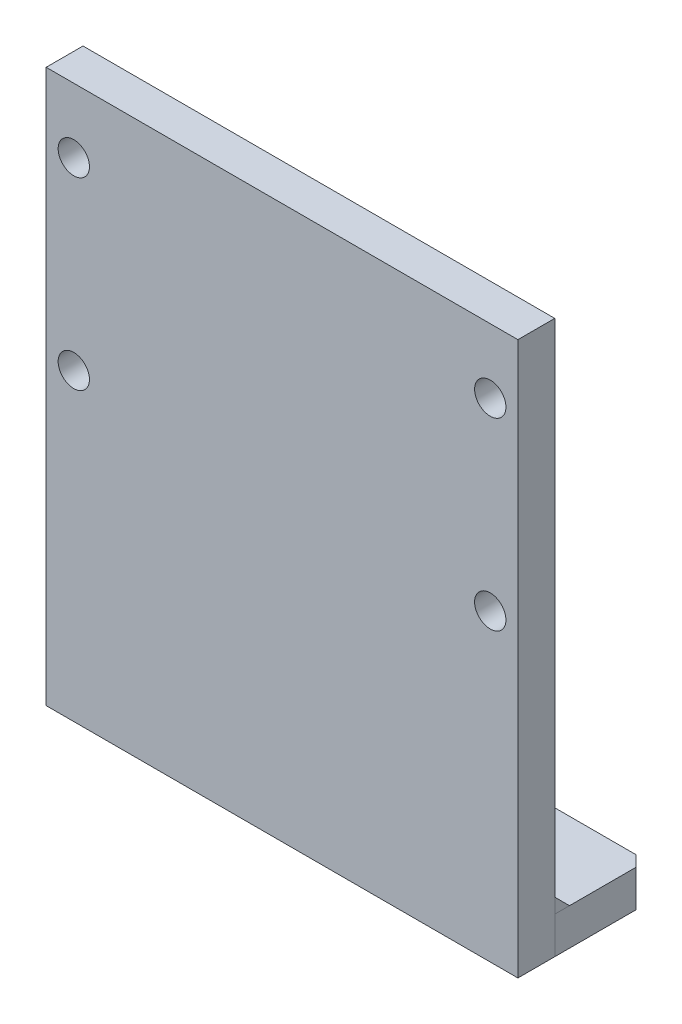
ISO-10303-21;
HEADER;
FILE_DESCRIPTION(('STEP AP214'),'2;1');
FILE_NAME('part.step','',(''),(''),'','','');
FILE_SCHEMA(('AUTOMOTIVE_DESIGN { 1 0 10303 214 1 1 1 1 }'));
ENDSEC;
DATA;
#1=APPLICATION_CONTEXT('core data for automotive mechanical design processes');
#2=APPLICATION_PROTOCOL_DEFINITION('international standard','automotive_design',2000,#1);
#3=PRODUCT_CONTEXT('',#1,'mechanical');
#4=PRODUCT('Part','Part','',(#3));
#5=PRODUCT_RELATED_PRODUCT_CATEGORY('part','',(#4));
#6=PRODUCT_DEFINITION_FORMATION('','',#4);
#7=PRODUCT_DEFINITION_CONTEXT('part definition',#1,'design');
#8=PRODUCT_DEFINITION('design','',#6,#7);
#9=PRODUCT_DEFINITION_SHAPE('','',#8);
#10=(LENGTH_UNIT() NAMED_UNIT(*) SI_UNIT(.MILLI.,.METRE.));
#11=(NAMED_UNIT(*) PLANE_ANGLE_UNIT() SI_UNIT($,.RADIAN.));
#12=(NAMED_UNIT(*) SI_UNIT($,.STERADIAN.) SOLID_ANGLE_UNIT());
#13=UNCERTAINTY_MEASURE_WITH_UNIT(LENGTH_MEASURE(1.E-05),#10,'distance_accuracy_value','');
#14=(GEOMETRIC_REPRESENTATION_CONTEXT(3) GLOBAL_UNCERTAINTY_ASSIGNED_CONTEXT((#13)) GLOBAL_UNIT_ASSIGNED_CONTEXT((#10,
#11,#12)) REPRESENTATION_CONTEXT('',''));
#15=CARTESIAN_POINT('',(0.,0.,0.));
#16=DIRECTION('',(0.,0.,1.));
#17=DIRECTION('',(1.,0.,0.));
#18=AXIS2_PLACEMENT_3D('',#15,#16,#17);
#19=CARTESIAN_POINT('',(-64.,-65.,-5.));
#20=DIRECTION('',(-1.,0.,0.));
#21=DIRECTION('',(0.,-1.,0.));
#22=AXIS2_PLACEMENT_3D('',#19,#20,#21);
#23=PLANE('',#22);
#24=DIRECTION('',(0.,-0.707106781186549,-0.707106781186546));
#25=VECTOR('',#24,1.);
#26=CARTESIAN_POINT('',(-64.,-65.,-8.99999999999999));
#27=LINE('',#26,#25);
#28=CARTESIAN_POINT('',(-64.,-61.,-5.));
#29=VERTEX_POINT('',#28);
#30=CARTESIAN_POINT('',(-64.,-65.,-8.99999999999999));
#31=VERTEX_POINT('',#30);
#32=EDGE_CURVE('E12',#29,#31,#27,.T.);
#33=ORIENTED_EDGE('',*,*,#32,.T.);
#34=DIRECTION('',(0.,0.,-1.));
#35=VECTOR('',#34,1.);
#36=CARTESIAN_POINT('',(-64.,-65.,-30.));
#37=LINE('',#36,#35);
#38=CARTESIAN_POINT('',(-64.,-65.,-5.));
#39=VERTEX_POINT('',#38);
#40=EDGE_CURVE('E85',#31,#39,#37,.F.);
#41=ORIENTED_EDGE('',*,*,#40,.T.);
#42=DIRECTION('',(0.,-1.,0.));
#43=VECTOR('',#42,1.);
#44=CARTESIAN_POINT('',(-64.,-65.,-5.));
#45=LINE('',#44,#43);
#46=EDGE_CURVE('E87',#29,#39,#45,.T.);
#47=ORIENTED_EDGE('',*,*,#46,.F.);
#48=EDGE_LOOP('',(#33,#41,#47));
#49=FACE_BOUND('',#48,.T.);
#50=ADVANCED_FACE('F47',(#49),#23,.T.);
#51=CARTESIAN_POINT('',(64.,-65.,-5.));
#52=DIRECTION('',(1.,0.,0.));
#53=DIRECTION('',(0.,1.,0.));
#54=AXIS2_PLACEMENT_3D('',#51,#52,#53);
#55=PLANE('',#54);
#56=DIRECTION('',(0.,0.,-1.));
#57=VECTOR('',#56,1.);
#58=CARTESIAN_POINT('',(64.,-65.,-5.));
#59=LINE('',#58,#57);
#60=CARTESIAN_POINT('',(64.,-65.,-8.99999999999999));
#61=VERTEX_POINT('',#60);
#62=CARTESIAN_POINT('',(64.,-65.,-5.));
#63=VERTEX_POINT('',#62);
#64=EDGE_CURVE('E68',#61,#63,#59,.F.);
#65=ORIENTED_EDGE('',*,*,#64,.F.);
#66=DIRECTION('',(0.,0.707106781186549,0.707106781186546));
#67=VECTOR('',#66,1.);
#68=CARTESIAN_POINT('',(64.,-65.,-8.99999999999998));
#69=LINE('',#68,#67);
#70=CARTESIAN_POINT('',(64.,-61.,-5.));
#71=VERTEX_POINT('',#70);
#72=EDGE_CURVE('E55',#61,#71,#69,.T.);
#73=ORIENTED_EDGE('',*,*,#72,.T.);
#74=DIRECTION('',(0.,-1.,0.));
#75=VECTOR('',#74,1.);
#76=CARTESIAN_POINT('',(64.,75.,-5.));
#77=LINE('',#76,#75);
#78=EDGE_CURVE('E62',#71,#63,#77,.T.);
#79=ORIENTED_EDGE('',*,*,#78,.T.);
#80=EDGE_LOOP('',(#65,#73,#79));
#81=FACE_BOUND('',#80,.T.);
#82=ADVANCED_FACE('F102',(#81),#55,.T.);
#83=CARTESIAN_POINT('',(-64.,-65.,-8.99999999999999));
#84=DIRECTION('',(0.,-0.707106781186546,0.707106781186549));
#85=DIRECTION('',(0.,-0.707106781186549,-0.707106781186546));
#86=AXIS2_PLACEMENT_3D('',#83,#84,#85);
#87=PLANE('',#86);
#88=ORIENTED_EDGE('',*,*,#32,.F.);
#89=DIRECTION('',(-1.,0.,0.));
#90=VECTOR('',#89,1.);
#91=CARTESIAN_POINT('',(64.,-61.,-5.));
#92=LINE('',#91,#90);
#93=EDGE_CURVE('E90',#71,#29,#92,.T.);
#94=ORIENTED_EDGE('',*,*,#93,.F.);
#95=ORIENTED_EDGE('',*,*,#72,.F.);
#96=DIRECTION('',(1.,0.,0.));
#97=VECTOR('',#96,1.);
#98=CARTESIAN_POINT('',(-64.,-65.,-8.99999999999999));
#99=LINE('',#98,#97);
#100=EDGE_CURVE('E98',#31,#61,#99,.T.);
#101=ORIENTED_EDGE('',*,*,#100,.F.);
#102=EDGE_LOOP('',(#88,#94,#95,#101));
#103=FACE_BOUND('',#102,.T.);
#104=ADVANCED_FACE('F49',(#103),#87,.F.);
#105=CARTESIAN_POINT('',(-64.,-65.,-30.));
#106=DIRECTION('',(0.,-1.,0.));
#107=DIRECTION('',(0.,0.,-1.));
#108=AXIS2_PLACEMENT_3D('',#105,#106,#107);
#109=PLANE('',#108);
#110=ORIENTED_EDGE('',*,*,#100,.T.);
#111=ORIENTED_EDGE('',*,*,#64,.T.);
#112=DIRECTION('',(1.,0.,0.));
#113=VECTOR('',#112,1.);
#114=CARTESIAN_POINT('',(-64.,-65.,-5.));
#115=LINE('',#114,#113);
#116=EDGE_CURVE('E81',#39,#63,#115,.T.);
#117=ORIENTED_EDGE('',*,*,#116,.F.);
#118=ORIENTED_EDGE('',*,*,#40,.F.);
#119=EDGE_LOOP('',(#110,#111,#117,#118));
#120=FACE_BOUND('',#119,.T.);
#121=ADVANCED_FACE('F83',(#120),#109,.T.);
#122=CARTESIAN_POINT('',(64.,75.,-5.));
#123=DIRECTION('',(0.,0.,-1.));
#124=DIRECTION('',(-1.,0.,0.));
#125=AXIS2_PLACEMENT_3D('',#122,#123,#124);
#126=PLANE('',#125);
#127=ORIENTED_EDGE('',*,*,#93,.T.);
#128=ORIENTED_EDGE('',*,*,#46,.T.);
#129=ORIENTED_EDGE('',*,*,#116,.T.);
#130=ORIENTED_EDGE('',*,*,#78,.F.);
#131=EDGE_LOOP('',(#127,#128,#129,#130));
#132=FACE_BOUND('',#131,.T.);
#133=ADVANCED_FACE('F88',(#132),#126,.F.);
#134=CLOSED_SHELL('',(#50,#82,#104,#121,#133));
#135=MANIFOLD_SOLID_BREP('B2',#134);
#136=CARTESIAN_POINT('',(-64.,-65.,-5.));
#137=DIRECTION('',(-1.,0.,0.));
#138=DIRECTION('',(0.,-1.,0.));
#139=AXIS2_PLACEMENT_3D('',#136,#137,#138);
#140=PLANE('',#139);
#141=DIRECTION('',(0.,0.,-1.));
#142=VECTOR('',#141,1.);
#143=CARTESIAN_POINT('',(-64.,-65.,-5.));
#144=LINE('',#143,#142);
#145=CARTESIAN_POINT('',(-64.,-65.,-5.));
#146=VERTEX_POINT('',#145);
#147=CARTESIAN_POINT('',(-64.,-65.,-27.));
#148=VERTEX_POINT('',#147);
#149=EDGE_CURVE('E229',#146,#148,#144,.T.);
#150=ORIENTED_EDGE('',*,*,#149,.T.);
#151=DIRECTION('',(0.,-1.,0.));
#152=VECTOR('',#151,1.);
#153=CARTESIAN_POINT('',(-64.,-65.,-27.));
#154=LINE('',#153,#152);
#155=CARTESIAN_POINT('',(-64.,-75.,-27.));
#156=VERTEX_POINT('',#155);
#157=EDGE_CURVE('E243',#148,#156,#154,.T.);
#158=ORIENTED_EDGE('',*,*,#157,.T.);
#159=DIRECTION('',(0.,0.,-1.));
#160=VECTOR('',#159,1.);
#161=CARTESIAN_POINT('',(-64.,-75.,-5.));
#162=LINE('',#161,#160);
#163=CARTESIAN_POINT('',(-64.,-75.,-5.));
#164=VERTEX_POINT('',#163);
#165=EDGE_CURVE('E233',#164,#156,#162,.T.);
#166=ORIENTED_EDGE('',*,*,#165,.F.);
#167=DIRECTION('',(0.,-1.,0.));
#168=VECTOR('',#167,1.);
#169=CARTESIAN_POINT('',(-64.,-65.,-5.));
#170=LINE('',#169,#168);
#171=EDGE_CURVE('E224',#146,#164,#170,.T.);
#172=ORIENTED_EDGE('',*,*,#171,.F.);
#173=EDGE_LOOP('',(#150,#158,#166,#172));
#174=FACE_BOUND('',#173,.T.);
#175=ADVANCED_FACE('F159',(#174),#140,.T.);
#176=CARTESIAN_POINT('',(-64.,-65.,-5.));
#177=DIRECTION('',(0.,0.,1.));
#178=DIRECTION('',(1.,0.,0.));
#179=AXIS2_PLACEMENT_3D('',#176,#177,#178);
#180=PLANE('',#179);
#181=DIRECTION('',(-1.,0.,0.));
#182=VECTOR('',#181,1.);
#183=CARTESIAN_POINT('',(-64.,-75.,-5.));
#184=LINE('',#183,#182);
#185=CARTESIAN_POINT('',(64.,-75.,-5.));
#186=VERTEX_POINT('',#185);
#187=EDGE_CURVE('E223',#186,#164,#184,.T.);
#188=ORIENTED_EDGE('',*,*,#187,.F.);
#189=DIRECTION('',(0.,-1.,0.));
#190=VECTOR('',#189,1.);
#191=CARTESIAN_POINT('',(64.,-65.,-5.));
#192=LINE('',#191,#190);
#193=CARTESIAN_POINT('',(64.,-65.,-5.));
#194=VERTEX_POINT('',#193);
#195=EDGE_CURVE('E213',#194,#186,#192,.T.);
#196=ORIENTED_EDGE('',*,*,#195,.F.);
#197=DIRECTION('',(-1.,0.,0.));
#198=VECTOR('',#197,1.);
#199=CARTESIAN_POINT('',(-64.,-65.,-5.));
#200=LINE('',#199,#198);
#201=EDGE_CURVE('E216',#194,#146,#200,.T.);
#202=ORIENTED_EDGE('',*,*,#201,.T.);
#203=ORIENTED_EDGE('',*,*,#171,.T.);
#204=EDGE_LOOP('',(#188,#196,#202,#203));
#205=FACE_BOUND('',#204,.T.);
#206=ADVANCED_FACE('F221',(#205),#180,.T.);
#207=CARTESIAN_POINT('',(64.,-65.,-5.));
#208=DIRECTION('',(1.,0.,0.));
#209=DIRECTION('',(0.,1.,0.));
#210=AXIS2_PLACEMENT_3D('',#207,#208,#209);
#211=PLANE('',#210);
#212=DIRECTION('',(0.,0.,1.));
#213=VECTOR('',#212,1.);
#214=CARTESIAN_POINT('',(64.,-75.,-5.));
#215=LINE('',#214,#213);
#216=CARTESIAN_POINT('',(64.,-75.,-27.));
#217=VERTEX_POINT('',#216);
#218=EDGE_CURVE('E240',#217,#186,#215,.T.);
#219=ORIENTED_EDGE('',*,*,#218,.F.);
#220=DIRECTION('',(0.,1.,0.));
#221=VECTOR('',#220,1.);
#222=CARTESIAN_POINT('',(64.,-65.,-27.));
#223=LINE('',#222,#221);
#224=CARTESIAN_POINT('',(64.,-65.,-27.));
#225=VERTEX_POINT('',#224);
#226=EDGE_CURVE('E45',#217,#225,#223,.T.);
#227=ORIENTED_EDGE('',*,*,#226,.T.);
#228=DIRECTION('',(0.,0.,1.));
#229=VECTOR('',#228,1.);
#230=CARTESIAN_POINT('',(64.,-65.,-5.));
#231=LINE('',#230,#229);
#232=EDGE_CURVE('E210',#225,#194,#231,.T.);
#233=ORIENTED_EDGE('',*,*,#232,.T.);
#234=ORIENTED_EDGE('',*,*,#195,.T.);
#235=EDGE_LOOP('',(#219,#227,#233,#234));
#236=FACE_BOUND('',#235,.T.);
#237=ADVANCED_FACE('F212',(#236),#211,.T.);
#238=CARTESIAN_POINT('',(-64.,-65.,-30.));
#239=DIRECTION('',(0.,0.,-1.));
#240=DIRECTION('',(-1.,0.,0.));
#241=AXIS2_PLACEMENT_3D('',#238,#239,#240);
#242=PLANE('',#241);
#243=DIRECTION('',(1.,0.,0.));
#244=VECTOR('',#243,1.);
#245=CARTESIAN_POINT('',(-64.,-75.,-30.));
#246=LINE('',#245,#244);
#247=CARTESIAN_POINT('',(-61.,-75.,-30.));
#248=VERTEX_POINT('',#247);
#249=CARTESIAN_POINT('',(61.,-75.,-30.));
#250=VERTEX_POINT('',#249);
#251=EDGE_CURVE('E236',#248,#250,#246,.T.);
#252=ORIENTED_EDGE('',*,*,#251,.F.);
#253=DIRECTION('',(0.,1.,0.));
#254=VECTOR('',#253,1.);
#255=CARTESIAN_POINT('',(-61.,-65.,-30.));
#256=LINE('',#255,#254);
#257=CARTESIAN_POINT('',(-61.,-65.,-30.));
#258=VERTEX_POINT('',#257);
#259=EDGE_CURVE('E254',#248,#258,#256,.T.);
#260=ORIENTED_EDGE('',*,*,#259,.T.);
#261=DIRECTION('',(1.,0.,0.));
#262=VECTOR('',#261,1.);
#263=CARTESIAN_POINT('',(-64.,-65.,-30.));
#264=LINE('',#263,#262);
#265=CARTESIAN_POINT('',(61.,-65.,-30.));
#266=VERTEX_POINT('',#265);
#267=EDGE_CURVE('E217',#258,#266,#264,.T.);
#268=ORIENTED_EDGE('',*,*,#267,.T.);
#269=DIRECTION('',(0.,-1.,0.));
#270=VECTOR('',#269,1.);
#271=CARTESIAN_POINT('',(61.,-65.,-30.));
#272=LINE('',#271,#270);
#273=EDGE_CURVE('E251',#266,#250,#272,.T.);
#274=ORIENTED_EDGE('',*,*,#273,.T.);
#275=EDGE_LOOP('',(#252,#260,#268,#274));
#276=FACE_BOUND('',#275,.T.);
#277=ADVANCED_FACE('F268',(#276),#242,.T.);
#278=CARTESIAN_POINT('',(-64.,-65.,-30.));
#279=DIRECTION('',(0.,-1.,0.));
#280=DIRECTION('',(0.,0.,-1.));
#281=AXIS2_PLACEMENT_3D('',#278,#279,#280);
#282=PLANE('',#281);
#283=CARTESIAN_POINT('',(40.,-65.,-20.));
#284=DIRECTION('',(0.,-1.,0.));
#285=DIRECTION('',(-1.,0.,0.));
#286=AXIS2_PLACEMENT_3D('',#283,#284,#285);
#287=CIRCLE('',#286,4.25);
#288=CARTESIAN_POINT('',(35.75,-65.,-20.));
#289=VERTEX_POINT('',#288);
#290=EDGE_CURVE('E304',#289,#289,#287,.T.);
#291=ORIENTED_EDGE('',*,*,#290,.T.);
#292=EDGE_LOOP('',(#291));
#293=FACE_BOUND('',#292,.T.);
#294=CARTESIAN_POINT('',(-40.,-65.,-20.));
#295=DIRECTION('',(0.,-1.,0.));
#296=DIRECTION('',(1.,0.,0.));
#297=AXIS2_PLACEMENT_3D('',#294,#295,#296);
#298=CIRCLE('',#297,4.25);
#299=CARTESIAN_POINT('',(-35.75,-65.,-20.));
#300=VERTEX_POINT('',#299);
#301=EDGE_CURVE('E237',#300,#300,#298,.T.);
#302=ORIENTED_EDGE('',*,*,#301,.T.);
#303=EDGE_LOOP('',(#302));
#304=FACE_BOUND('',#303,.T.);
#305=ORIENTED_EDGE('',*,*,#267,.F.);
#306=DIRECTION('',(0.707106781186549,0.,-0.707106781186546));
#307=VECTOR('',#306,1.);
#308=CARTESIAN_POINT('',(-64.,-65.,-27.));
#309=LINE('',#308,#307);
#310=EDGE_CURVE('E167',#258,#148,#309,.F.);
#311=ORIENTED_EDGE('',*,*,#310,.T.);
#312=ORIENTED_EDGE('',*,*,#149,.F.);
#313=ORIENTED_EDGE('',*,*,#201,.F.);
#314=ORIENTED_EDGE('',*,*,#232,.F.);
#315=DIRECTION('',(0.707106781186544,0.,0.707106781186551));
#316=VECTOR('',#315,1.);
#317=CARTESIAN_POINT('',(61.,-65.,-30.));
#318=LINE('',#317,#316);
#319=EDGE_CURVE('E179',#225,#266,#318,.F.);
#320=ORIENTED_EDGE('',*,*,#319,.T.);
#321=EDGE_LOOP('',(#305,#311,#312,#313,#314,#320));
#322=FACE_BOUND('',#321,.T.);
#323=ADVANCED_FACE('F227',(#293,#304,#322),#282,.F.);
#324=CARTESIAN_POINT('',(-64.,-75.,-30.));
#325=DIRECTION('',(0.,-1.,0.));
#326=DIRECTION('',(0.,0.,-1.));
#327=AXIS2_PLACEMENT_3D('',#324,#325,#326);
#328=PLANE('',#327);
#329=CARTESIAN_POINT('',(40.,-75.,-20.));
#330=DIRECTION('',(0.,-1.,0.));
#331=DIRECTION('',(-1.,0.,0.));
#332=AXIS2_PLACEMENT_3D('',#329,#330,#331);
#333=CIRCLE('',#332,4.25);
#334=CARTESIAN_POINT('',(35.75,-75.,-20.));
#335=VERTEX_POINT('',#334);
#336=EDGE_CURVE('E307',#335,#335,#333,.T.);
#337=ORIENTED_EDGE('',*,*,#336,.F.);
#338=EDGE_LOOP('',(#337));
#339=FACE_BOUND('',#338,.T.);
#340=CARTESIAN_POINT('',(-40.,-75.,-20.));
#341=DIRECTION('',(0.,-1.,0.));
#342=DIRECTION('',(1.,0.,0.));
#343=AXIS2_PLACEMENT_3D('',#340,#341,#342);
#344=CIRCLE('',#343,4.25);
#345=CARTESIAN_POINT('',(-35.75,-75.,-20.));
#346=VERTEX_POINT('',#345);
#347=EDGE_CURVE('E309',#346,#346,#344,.T.);
#348=ORIENTED_EDGE('',*,*,#347,.F.);
#349=EDGE_LOOP('',(#348));
#350=FACE_BOUND('',#349,.T.);
#351=ORIENTED_EDGE('',*,*,#165,.T.);
#352=DIRECTION('',(-0.707106781186549,0.,0.707106781186546));
#353=VECTOR('',#352,1.);
#354=CARTESIAN_POINT('',(-62.5,-75.,-28.5));
#355=LINE('',#354,#353);
#356=EDGE_CURVE('E249',#156,#248,#355,.F.);
#357=ORIENTED_EDGE('',*,*,#356,.T.);
#358=ORIENTED_EDGE('',*,*,#251,.T.);
#359=DIRECTION('',(-0.707106781186544,0.,-0.707106781186551));
#360=VECTOR('',#359,1.);
#361=CARTESIAN_POINT('',(-1.49999999999942,-75.,-92.5));
#362=LINE('',#361,#360);
#363=EDGE_CURVE('E247',#250,#217,#362,.F.);
#364=ORIENTED_EDGE('',*,*,#363,.T.);
#365=ORIENTED_EDGE('',*,*,#218,.T.);
#366=ORIENTED_EDGE('',*,*,#187,.T.);
#367=EDGE_LOOP('',(#351,#357,#358,#364,#365,#366));
#368=FACE_BOUND('',#367,.T.);
#369=ADVANCED_FACE('F266',(#339,#350,#368),#328,.T.);
#370=CARTESIAN_POINT('',(-40.,-65.,-20.));
#371=DIRECTION('',(0.,-1.,0.));
#372=DIRECTION('',(1.,0.,0.));
#373=AXIS2_PLACEMENT_3D('',#370,#371,#372);
#374=CYLINDRICAL_SURFACE('',#373,4.25);
#375=ORIENTED_EDGE('',*,*,#301,.F.);
#376=EDGE_LOOP('',(#375));
#377=FACE_BOUND('',#376,.T.);
#378=ORIENTED_EDGE('',*,*,#347,.T.);
#379=EDGE_LOOP('',(#378));
#380=FACE_BOUND('',#379,.T.);
#381=ADVANCED_FACE('F289',(#377,#380),#374,.F.);
#382=CARTESIAN_POINT('',(40.,-65.,-20.));
#383=DIRECTION('',(0.,-1.,0.));
#384=DIRECTION('',(1.,0.,0.));
#385=AXIS2_PLACEMENT_3D('',#382,#383,#384);
#386=CYLINDRICAL_SURFACE('',#385,4.25);
#387=ORIENTED_EDGE('',*,*,#290,.F.);
#388=EDGE_LOOP('',(#387));
#389=FACE_BOUND('',#388,.T.);
#390=ORIENTED_EDGE('',*,*,#336,.T.);
#391=EDGE_LOOP('',(#390));
#392=FACE_BOUND('',#391,.T.);
#393=ADVANCED_FACE('F275',(#389,#392),#386,.F.);
#394=CARTESIAN_POINT('',(-64.,-65.,-27.));
#395=DIRECTION('',(0.707106781186546,0.,0.707106781186549));
#396=DIRECTION('',(0.707106781186549,0.,-0.707106781186546));
#397=AXIS2_PLACEMENT_3D('',#394,#395,#396);
#398=PLANE('',#397);
#399=ORIENTED_EDGE('',*,*,#310,.F.);
#400=ORIENTED_EDGE('',*,*,#259,.F.);
#401=ORIENTED_EDGE('',*,*,#356,.F.);
#402=ORIENTED_EDGE('',*,*,#157,.F.);
#403=EDGE_LOOP('',(#399,#400,#401,#402));
#404=FACE_BOUND('',#403,.T.);
#405=ADVANCED_FACE('F263',(#404),#398,.F.);
#406=CARTESIAN_POINT('',(61.,-65.,-30.));
#407=DIRECTION('',(-0.707106781186551,0.,0.707106781186544));
#408=DIRECTION('',(0.707106781186544,0.,0.707106781186551));
#409=AXIS2_PLACEMENT_3D('',#406,#407,#408);
#410=PLANE('',#409);
#411=ORIENTED_EDGE('',*,*,#319,.F.);
#412=ORIENTED_EDGE('',*,*,#226,.F.);
#413=ORIENTED_EDGE('',*,*,#363,.F.);
#414=ORIENTED_EDGE('',*,*,#273,.F.);
#415=EDGE_LOOP('',(#411,#412,#413,#414));
#416=FACE_BOUND('',#415,.T.);
#417=ADVANCED_FACE('F161',(#416),#410,.F.);
#418=CLOSED_SHELL('',(#175,#206,#237,#277,#323,#369,#381,#393,#405,#417));
#419=MANIFOLD_SOLID_BREP('B6',#418);
#420=CARTESIAN_POINT('',(64.,75.,5.));
#421=DIRECTION('',(0.,0.,-1.));
#422=DIRECTION('',(-1.,0.,0.));
#423=AXIS2_PLACEMENT_3D('',#420,#421,#422);
#424=PLANE('',#423);
#425=CARTESIAN_POINT('',(56.5000000000001,7.50000000000002,5.));
#426=DIRECTION('',(0.,0.,1.));
#427=DIRECTION('',(-1.,0.,0.));
#428=AXIS2_PLACEMENT_3D('',#425,#426,#427);
#429=CIRCLE('',#428,4.25);
#430=CARTESIAN_POINT('',(52.2500000000001,7.50000000000002,5.));
#431=VERTEX_POINT('',#430);
#432=EDGE_CURVE('E464',#431,#431,#429,.T.);
#433=ORIENTED_EDGE('',*,*,#432,.F.);
#434=EDGE_LOOP('',(#433));
#435=FACE_BOUND('',#434,.T.);
#436=CARTESIAN_POINT('',(-56.5000000000001,57.5,5.));
#437=DIRECTION('',(0.,0.,1.));
#438=DIRECTION('',(1.,0.,0.));
#439=AXIS2_PLACEMENT_3D('',#436,#437,#438);
#440=CIRCLE('',#439,4.25);
#441=CARTESIAN_POINT('',(-52.2500000000001,57.5,5.));
#442=VERTEX_POINT('',#441);
#443=EDGE_CURVE('E443',#442,#442,#440,.T.);
#444=ORIENTED_EDGE('',*,*,#443,.F.);
#445=EDGE_LOOP('',(#444));
#446=FACE_BOUND('',#445,.T.);
#447=DIRECTION('',(0.,1.,0.));
#448=VECTOR('',#447,1.);
#449=CARTESIAN_POINT('',(64.,-75.,5.));
#450=LINE('',#449,#448);
#451=CARTESIAN_POINT('',(64.,-75.,5.));
#452=VERTEX_POINT('',#451);
#453=CARTESIAN_POINT('',(64.,75.,5.));
#454=VERTEX_POINT('',#453);
#455=EDGE_CURVE('E428',#452,#454,#450,.T.);
#456=ORIENTED_EDGE('',*,*,#455,.T.);
#457=DIRECTION('',(-1.,0.,0.));
#458=VECTOR('',#457,1.);
#459=CARTESIAN_POINT('',(-64.,75.,5.));
#460=LINE('',#459,#458);
#461=CARTESIAN_POINT('',(-64.,75.,5.));
#462=VERTEX_POINT('',#461);
#463=EDGE_CURVE('E423',#454,#462,#460,.T.);
#464=ORIENTED_EDGE('',*,*,#463,.T.);
#465=DIRECTION('',(0.,-1.,0.));
#466=VECTOR('',#465,1.);
#467=CARTESIAN_POINT('',(-64.,-75.,5.));
#468=LINE('',#467,#466);
#469=CARTESIAN_POINT('',(-64.,-75.,5.));
#470=VERTEX_POINT('',#469);
#471=EDGE_CURVE('E426',#462,#470,#468,.T.);
#472=ORIENTED_EDGE('',*,*,#471,.T.);
#473=DIRECTION('',(1.,0.,0.));
#474=VECTOR('',#473,1.);
#475=CARTESIAN_POINT('',(-64.,-75.,5.));
#476=LINE('',#475,#474);
#477=EDGE_CURVE('E393',#470,#452,#476,.T.);
#478=ORIENTED_EDGE('',*,*,#477,.T.);
#479=EDGE_LOOP('',(#456,#464,#472,#478));
#480=FACE_BOUND('',#479,.T.);
#481=CARTESIAN_POINT('',(-56.5000000000001,7.50000000000001,5.));
#482=DIRECTION('',(0.,0.,1.));
#483=DIRECTION('',(1.,0.,0.));
#484=AXIS2_PLACEMENT_3D('',#481,#482,#483);
#485=CIRCLE('',#484,4.25);
#486=CARTESIAN_POINT('',(-52.2500000000001,7.50000000000001,5.));
#487=VERTEX_POINT('',#486);
#488=EDGE_CURVE('E458',#487,#487,#485,.T.);
#489=ORIENTED_EDGE('',*,*,#488,.F.);
#490=EDGE_LOOP('',(#489));
#491=FACE_BOUND('',#490,.T.);
#492=CARTESIAN_POINT('',(56.5000000000001,57.5,5.));
#493=DIRECTION('',(0.,0.,1.));
#494=DIRECTION('',(-1.,0.,0.));
#495=AXIS2_PLACEMENT_3D('',#492,#493,#494);
#496=CIRCLE('',#495,4.25);
#497=CARTESIAN_POINT('',(52.2500000000001,57.5,5.));
#498=VERTEX_POINT('',#497);
#499=EDGE_CURVE('E470',#498,#498,#496,.T.);
#500=ORIENTED_EDGE('',*,*,#499,.F.);
#501=EDGE_LOOP('',(#500));
#502=FACE_BOUND('',#501,.T.);
#503=ADVANCED_FACE('F376',(#435,#446,#480,#491,#502),#424,.F.);
#504=CARTESIAN_POINT('',(64.,75.,-5.));
#505=DIRECTION('',(0.,0.,-1.));
#506=DIRECTION('',(-1.,0.,0.));
#507=AXIS2_PLACEMENT_3D('',#504,#505,#506);
#508=PLANE('',#507);
#509=CARTESIAN_POINT('',(56.5000000000001,7.50000000000002,-5.));
#510=DIRECTION('',(0.,0.,1.));
#511=DIRECTION('',(-1.,0.,0.));
#512=AXIS2_PLACEMENT_3D('',#509,#510,#511);
#513=CIRCLE('',#512,4.25);
#514=CARTESIAN_POINT('',(52.2500000000001,7.50000000000002,-5.));
#515=VERTEX_POINT('',#514);
#516=EDGE_CURVE('E467',#515,#515,#513,.T.);
#517=ORIENTED_EDGE('',*,*,#516,.T.);
#518=EDGE_LOOP('',(#517));
#519=FACE_BOUND('',#518,.T.);
#520=CARTESIAN_POINT('',(-56.5000000000001,57.5,-5.));
#521=DIRECTION('',(0.,0.,1.));
#522=DIRECTION('',(1.,0.,0.));
#523=AXIS2_PLACEMENT_3D('',#520,#521,#522);
#524=CIRCLE('',#523,4.25);
#525=CARTESIAN_POINT('',(-52.2500000000001,57.5,-5.));
#526=VERTEX_POINT('',#525);
#527=EDGE_CURVE('E455',#526,#526,#524,.T.);
#528=ORIENTED_EDGE('',*,*,#527,.T.);
#529=EDGE_LOOP('',(#528));
#530=FACE_BOUND('',#529,.T.);
#531=DIRECTION('',(0.,1.,0.));
#532=VECTOR('',#531,1.);
#533=CARTESIAN_POINT('',(64.,-75.,-5.));
#534=LINE('',#533,#532);
#535=CARTESIAN_POINT('',(64.,-75.,-5.));
#536=VERTEX_POINT('',#535);
#537=CARTESIAN_POINT('',(64.,75.,-5.));
#538=VERTEX_POINT('',#537);
#539=EDGE_CURVE('E440',#536,#538,#534,.T.);
#540=ORIENTED_EDGE('',*,*,#539,.F.);
#541=DIRECTION('',(1.,0.,0.));
#542=VECTOR('',#541,1.);
#543=CARTESIAN_POINT('',(-64.,-75.,-5.));
#544=LINE('',#543,#542);
#545=CARTESIAN_POINT('',(-64.,-75.,-5.));
#546=VERTEX_POINT('',#545);
#547=EDGE_CURVE('E416',#546,#536,#544,.T.);
#548=ORIENTED_EDGE('',*,*,#547,.F.);
#549=DIRECTION('',(0.,-1.,0.));
#550=VECTOR('',#549,1.);
#551=CARTESIAN_POINT('',(-64.,-75.,-5.));
#552=LINE('',#551,#550);
#553=CARTESIAN_POINT('',(-64.,75.,-5.));
#554=VERTEX_POINT('',#553);
#555=EDGE_CURVE('E410',#554,#546,#552,.T.);
#556=ORIENTED_EDGE('',*,*,#555,.F.);
#557=DIRECTION('',(-1.,0.,0.));
#558=VECTOR('',#557,1.);
#559=CARTESIAN_POINT('',(-64.,75.,-5.));
#560=LINE('',#559,#558);
#561=EDGE_CURVE('E432',#538,#554,#560,.T.);
#562=ORIENTED_EDGE('',*,*,#561,.F.);
#563=EDGE_LOOP('',(#540,#548,#556,#562));
#564=FACE_BOUND('',#563,.T.);
#565=CARTESIAN_POINT('',(-56.5000000000001,7.50000000000001,-5.));
#566=DIRECTION('',(0.,0.,1.));
#567=DIRECTION('',(1.,0.,0.));
#568=AXIS2_PLACEMENT_3D('',#565,#566,#567);
#569=CIRCLE('',#568,4.25);
#570=CARTESIAN_POINT('',(-52.2500000000001,7.50000000000001,-5.));
#571=VERTEX_POINT('',#570);
#572=EDGE_CURVE('E461',#571,#571,#569,.T.);
#573=ORIENTED_EDGE('',*,*,#572,.T.);
#574=EDGE_LOOP('',(#573));
#575=FACE_BOUND('',#574,.T.);
#576=CARTESIAN_POINT('',(56.5000000000001,57.5,-5.));
#577=DIRECTION('',(0.,0.,1.));
#578=DIRECTION('',(-1.,0.,0.));
#579=AXIS2_PLACEMENT_3D('',#576,#577,#578);
#580=CIRCLE('',#579,4.25);
#581=CARTESIAN_POINT('',(52.2500000000001,57.5,-5.));
#582=VERTEX_POINT('',#581);
#583=EDGE_CURVE('E473',#582,#582,#580,.T.);
#584=ORIENTED_EDGE('',*,*,#583,.T.);
#585=EDGE_LOOP('',(#584));
#586=FACE_BOUND('',#585,.T.);
#587=ADVANCED_FACE('F451',(#519,#530,#564,#575,#586),#508,.T.);
#588=CARTESIAN_POINT('',(64.,-75.,5.));
#589=DIRECTION('',(-1.,0.,0.));
#590=DIRECTION('',(0.,-1.,0.));
#591=AXIS2_PLACEMENT_3D('',#588,#589,#590);
#592=PLANE('',#591);
#593=ORIENTED_EDGE('',*,*,#539,.T.);
#594=DIRECTION('',(0.,0.,-1.));
#595=VECTOR('',#594,1.);
#596=CARTESIAN_POINT('',(64.,75.,5.));
#597=LINE('',#596,#595);
#598=EDGE_CURVE('E157',#454,#538,#597,.T.);
#599=ORIENTED_EDGE('',*,*,#598,.F.);
#600=ORIENTED_EDGE('',*,*,#455,.F.);
#601=DIRECTION('',(0.,0.,-1.));
#602=VECTOR('',#601,1.);
#603=CARTESIAN_POINT('',(64.,-75.,5.));
#604=LINE('',#603,#602);
#605=EDGE_CURVE('E436',#452,#536,#604,.T.);
#606=ORIENTED_EDGE('',*,*,#605,.T.);
#607=EDGE_LOOP('',(#593,#599,#600,#606));
#608=FACE_BOUND('',#607,.T.);
#609=ADVANCED_FACE('F378',(#608),#592,.F.);
#610=CARTESIAN_POINT('',(-64.,75.,5.));
#611=DIRECTION('',(0.,-1.,0.));
#612=DIRECTION('',(1.,0.,0.));
#613=AXIS2_PLACEMENT_3D('',#610,#611,#612);
#614=PLANE('',#613);
#615=ORIENTED_EDGE('',*,*,#561,.T.);
#616=DIRECTION('',(0.,0.,-1.));
#617=VECTOR('',#616,1.);
#618=CARTESIAN_POINT('',(-64.,75.,5.));
#619=LINE('',#618,#617);
#620=EDGE_CURVE('E385',#462,#554,#619,.T.);
#621=ORIENTED_EDGE('',*,*,#620,.F.);
#622=ORIENTED_EDGE('',*,*,#463,.F.);
#623=ORIENTED_EDGE('',*,*,#598,.T.);
#624=EDGE_LOOP('',(#615,#621,#622,#623));
#625=FACE_BOUND('',#624,.T.);
#626=ADVANCED_FACE('F431',(#625),#614,.F.);
#627=CARTESIAN_POINT('',(-64.,-75.,5.));
#628=DIRECTION('',(1.,0.,0.));
#629=DIRECTION('',(0.,1.,0.));
#630=AXIS2_PLACEMENT_3D('',#627,#628,#629);
#631=PLANE('',#630);
#632=ORIENTED_EDGE('',*,*,#555,.T.);
#633=DIRECTION('',(0.,0.,-1.));
#634=VECTOR('',#633,1.);
#635=CARTESIAN_POINT('',(-64.,-75.,5.));
#636=LINE('',#635,#634);
#637=EDGE_CURVE('E433',#470,#546,#636,.T.);
#638=ORIENTED_EDGE('',*,*,#637,.F.);
#639=ORIENTED_EDGE('',*,*,#471,.F.);
#640=ORIENTED_EDGE('',*,*,#620,.T.);
#641=EDGE_LOOP('',(#632,#638,#639,#640));
#642=FACE_BOUND('',#641,.T.);
#643=ADVANCED_FACE('F434',(#642),#631,.F.);
#644=CARTESIAN_POINT('',(-64.,-75.,5.));
#645=DIRECTION('',(0.,1.,0.));
#646=DIRECTION('',(-1.,0.,0.));
#647=AXIS2_PLACEMENT_3D('',#644,#645,#646);
#648=PLANE('',#647);
#649=ORIENTED_EDGE('',*,*,#547,.T.);
#650=ORIENTED_EDGE('',*,*,#605,.F.);
#651=ORIENTED_EDGE('',*,*,#477,.F.);
#652=ORIENTED_EDGE('',*,*,#637,.T.);
#653=EDGE_LOOP('',(#649,#650,#651,#652));
#654=FACE_BOUND('',#653,.T.);
#655=ADVANCED_FACE('F448',(#654),#648,.F.);
#656=CARTESIAN_POINT('',(-56.5000000000001,57.5,5.));
#657=DIRECTION('',(0.,0.,-1.));
#658=DIRECTION('',(-1.,0.,0.));
#659=AXIS2_PLACEMENT_3D('',#656,#657,#658);
#660=CYLINDRICAL_SURFACE('',#659,4.25);
#661=ORIENTED_EDGE('',*,*,#443,.T.);
#662=EDGE_LOOP('',(#661));
#663=FACE_BOUND('',#662,.T.);
#664=ORIENTED_EDGE('',*,*,#527,.F.);
#665=EDGE_LOOP('',(#664));
#666=FACE_BOUND('',#665,.T.);
#667=ADVANCED_FACE('F493',(#663,#666),#660,.F.);
#668=CARTESIAN_POINT('',(-56.5000000000001,7.50000000000001,5.));
#669=DIRECTION('',(0.,0.,-1.));
#670=DIRECTION('',(-1.,0.,0.));
#671=AXIS2_PLACEMENT_3D('',#668,#669,#670);
#672=CYLINDRICAL_SURFACE('',#671,4.25);
#673=ORIENTED_EDGE('',*,*,#488,.T.);
#674=EDGE_LOOP('',(#673));
#675=FACE_BOUND('',#674,.T.);
#676=ORIENTED_EDGE('',*,*,#572,.F.);
#677=EDGE_LOOP('',(#676));
#678=FACE_BOUND('',#677,.T.);
#679=ADVANCED_FACE('F539',(#675,#678),#672,.F.);
#680=CARTESIAN_POINT('',(56.5000000000001,7.50000000000002,5.));
#681=DIRECTION('',(0.,0.,-1.));
#682=DIRECTION('',(-1.,0.,0.));
#683=AXIS2_PLACEMENT_3D('',#680,#681,#682);
#684=CYLINDRICAL_SURFACE('',#683,4.25);
#685=ORIENTED_EDGE('',*,*,#432,.T.);
#686=EDGE_LOOP('',(#685));
#687=FACE_BOUND('',#686,.T.);
#688=ORIENTED_EDGE('',*,*,#516,.F.);
#689=EDGE_LOOP('',(#688));
#690=FACE_BOUND('',#689,.T.);
#691=ADVANCED_FACE('F547',(#687,#690),#684,.F.);
#692=CARTESIAN_POINT('',(56.5000000000001,57.5,5.));
#693=DIRECTION('',(0.,0.,-1.));
#694=DIRECTION('',(-1.,0.,0.));
#695=AXIS2_PLACEMENT_3D('',#692,#693,#694);
#696=CYLINDRICAL_SURFACE('',#695,4.25);
#697=ORIENTED_EDGE('',*,*,#499,.T.);
#698=EDGE_LOOP('',(#697));
#699=FACE_BOUND('',#698,.T.);
#700=ORIENTED_EDGE('',*,*,#583,.F.);
#701=EDGE_LOOP('',(#700));
#702=FACE_BOUND('',#701,.T.);
#703=ADVANCED_FACE('F479',(#699,#702),#696,.F.);
#704=CLOSED_SHELL('',(#503,#587,#609,#626,#643,#655,#667,#679,#691,#703));
#705=MANIFOLD_SOLID_BREP('B39',#704);
#706=ADVANCED_BREP_SHAPE_REPRESENTATION('',(#18,#135,#419,#705),#14);
#707=SHAPE_DEFINITION_REPRESENTATION(#9,#706);
ENDSEC;
END-ISO-10303-21;
